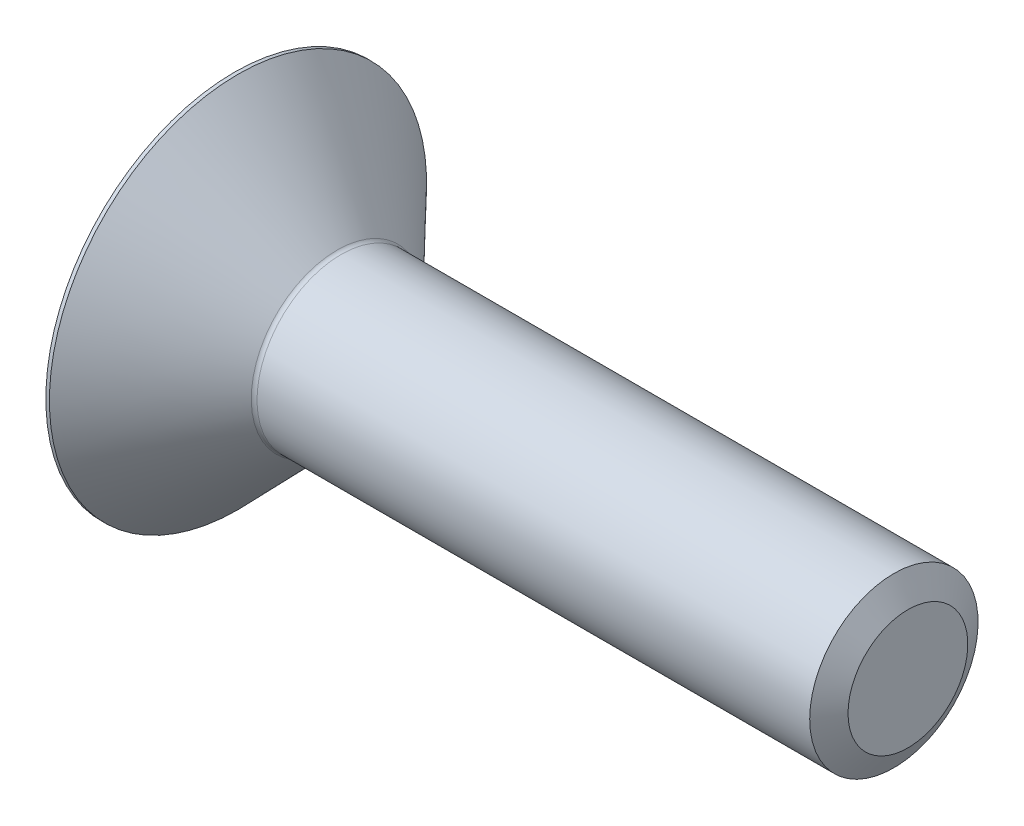
ISO-10303-21;
HEADER;
FILE_DESCRIPTION(('STEP AP214'),'2;1');
FILE_NAME('part.step','',(''),(''),'','','');
FILE_SCHEMA(('AUTOMOTIVE_DESIGN { 1 0 10303 214 1 1 1 1 }'));
ENDSEC;
DATA;
#1=APPLICATION_CONTEXT('core data for automotive mechanical design processes');
#2=APPLICATION_PROTOCOL_DEFINITION('international standard','automotive_design',2000,#1);
#3=PRODUCT_CONTEXT('',#1,'mechanical');
#4=PRODUCT('Part','Part','',(#3));
#5=PRODUCT_RELATED_PRODUCT_CATEGORY('part','',(#4));
#6=PRODUCT_DEFINITION_FORMATION('','',#4);
#7=PRODUCT_DEFINITION_CONTEXT('part definition',#1,'design');
#8=PRODUCT_DEFINITION('design','',#6,#7);
#9=PRODUCT_DEFINITION_SHAPE('','',#8);
#10=(LENGTH_UNIT() NAMED_UNIT(*) SI_UNIT(.MILLI.,.METRE.));
#11=(NAMED_UNIT(*) PLANE_ANGLE_UNIT() SI_UNIT($,.RADIAN.));
#12=(NAMED_UNIT(*) SI_UNIT($,.STERADIAN.) SOLID_ANGLE_UNIT());
#13=UNCERTAINTY_MEASURE_WITH_UNIT(LENGTH_MEASURE(1.E-05),#10,'distance_accuracy_value','');
#14=(GEOMETRIC_REPRESENTATION_CONTEXT(3) GLOBAL_UNCERTAINTY_ASSIGNED_CONTEXT((#13)) GLOBAL_UNIT_ASSIGNED_CONTEXT((#10,
#11,#12)) REPRESENTATION_CONTEXT('',''));
#15=CARTESIAN_POINT('',(0.,0.,0.));
#16=DIRECTION('',(0.,0.,1.));
#17=DIRECTION('',(1.,0.,0.));
#18=AXIS2_PLACEMENT_3D('',#15,#16,#17);
#19=CARTESIAN_POINT('',(0.,0.,0.));
#20=DIRECTION('',(1.,0.,0.));
#21=DIRECTION('',(0.,1.,0.));
#22=AXIS2_PLACEMENT_3D('',#19,#20,#21);
#23=CYLINDRICAL_SURFACE('',#22,1.5);
#24=CARTESIAN_POINT('',(-10.097552518379,0.,0.));
#25=DIRECTION('',(1.,0.,0.));
#26=DIRECTION('',(0.,1.,0.));
#27=AXIS2_PLACEMENT_3D('',#24,#25,#26);
#28=CIRCLE('',#27,1.5);
#29=CARTESIAN_POINT('',(-10.097552518379,1.5,0.));
#30=VERTEX_POINT('',#29);
#31=EDGE_CURVE('E123',#30,#30,#28,.T.);
#32=ORIENTED_EDGE('',*,*,#31,.T.);
#33=EDGE_LOOP('',(#32));
#34=FACE_BOUND('',#33,.T.);
#35=CARTESIAN_POINT('',(-0.25,0.,0.));
#36=DIRECTION('',(-1.,0.,0.));
#37=DIRECTION('',(0.,0.,1.));
#38=AXIS2_PLACEMENT_3D('',#35,#36,#37);
#39=CIRCLE('',#38,1.5);
#40=CARTESIAN_POINT('',(-0.25,0.,1.5));
#41=VERTEX_POINT('',#40);
#42=EDGE_CURVE('E114',#41,#41,#39,.T.);
#43=ORIENTED_EDGE('',*,*,#42,.T.);
#44=EDGE_LOOP('',(#43));
#45=FACE_BOUND('',#44,.T.);
#46=ADVANCED_FACE('F36',(#34,#45),#23,.T.);
#47=CARTESIAN_POINT('',(-12.,3.36,0.));
#48=DIRECTION('',(-1.,0.,0.));
#49=DIRECTION('',(0.,-1.,0.));
#50=AXIS2_PLACEMENT_3D('',#47,#48,#49);
#51=PLANE('',#50);
#52=CARTESIAN_POINT('',(-12.,0.,0.));
#53=DIRECTION('',(1.,0.,0.));
#54=DIRECTION('',(0.,1.,0.));
#55=AXIS2_PLACEMENT_3D('',#52,#53,#54);
#56=CIRCLE('',#55,3.36);
#57=CARTESIAN_POINT('',(-12.,3.36,0.));
#58=VERTEX_POINT('',#57);
#59=EDGE_CURVE('E206',#58,#58,#56,.T.);
#60=ORIENTED_EDGE('',*,*,#59,.F.);
#61=EDGE_LOOP('',(#60));
#62=FACE_BOUND('',#61,.T.);
#63=CARTESIAN_POINT('',(-12.,0.,0.));
#64=DIRECTION('',(-1.,0.,0.));
#65=DIRECTION('',(0.,-1.,0.));
#66=AXIS2_PLACEMENT_3D('',#63,#64,#65);
#67=CIRCLE('',#66,1.15470053837925);
#68=CARTESIAN_POINT('',(-12.,-0.577350269189631,0.999999999999995));
#69=VERTEX_POINT('',#68);
#70=CARTESIAN_POINT('',(-12.,-1.15470053837925,0.));
#71=VERTEX_POINT('',#70);
#72=EDGE_CURVE('E40',#69,#71,#67,.F.);
#73=ORIENTED_EDGE('',*,*,#72,.T.);
#74=CARTESIAN_POINT('',(-12.,-0.577350269189631,-0.999999999999996));
#75=VERTEX_POINT('',#74);
#76=EDGE_CURVE('E11',#71,#75,#67,.F.);
#77=ORIENTED_EDGE('',*,*,#76,.T.);
#78=CARTESIAN_POINT('',(-12.,0.577350269189625,-1.));
#79=VERTEX_POINT('',#78);
#80=EDGE_CURVE('E45',#75,#79,#67,.F.);
#81=ORIENTED_EDGE('',*,*,#80,.T.);
#82=CARTESIAN_POINT('',(-12.,1.15470053837925,0.));
#83=VERTEX_POINT('',#82);
#84=EDGE_CURVE('E110',#79,#83,#67,.F.);
#85=ORIENTED_EDGE('',*,*,#84,.T.);
#86=CARTESIAN_POINT('',(-12.,0.,0.));
#87=DIRECTION('',(-1.,0.,0.));
#88=DIRECTION('',(0.,0.,1.));
#89=AXIS2_PLACEMENT_3D('',#86,#87,#88);
#90=CIRCLE('',#89,1.15470053837925);
#91=CARTESIAN_POINT('',(-12.,0.577350269189628,0.999999999999997));
#92=VERTEX_POINT('',#91);
#93=EDGE_CURVE('E95',#92,#83,#90,.T.);
#94=ORIENTED_EDGE('',*,*,#93,.F.);
#95=EDGE_CURVE('E104',#92,#69,#67,.F.);
#96=ORIENTED_EDGE('',*,*,#95,.T.);
#97=EDGE_LOOP('',(#73,#77,#81,#85,#94,#96));
#98=FACE_BOUND('',#97,.T.);
#99=ADVANCED_FACE('F111',(#62,#98),#51,.T.);
#100=CARTESIAN_POINT('',(0.,0.,0.));
#101=DIRECTION('',(1.,0.,0.));
#102=DIRECTION('',(0.,1.,0.));
#103=AXIS2_PLACEMENT_3D('',#100,#101,#102);
#104=CYLINDRICAL_SURFACE('',#103,3.36);
#105=ORIENTED_EDGE('',*,*,#59,.T.);
#106=EDGE_LOOP('',(#105));
#107=FACE_BOUND('',#106,.T.);
#108=CARTESIAN_POINT('',(-11.9361811211411,0.,0.));
#109=DIRECTION('',(1.,0.,0.));
#110=DIRECTION('',(0.,1.,0.));
#111=AXIS2_PLACEMENT_3D('',#108,#109,#110);
#112=CIRCLE('',#111,3.36);
#113=CARTESIAN_POINT('',(-11.9361811211411,3.36,0.));
#114=VERTEX_POINT('',#113);
#115=EDGE_CURVE('E208',#114,#114,#112,.T.);
#116=ORIENTED_EDGE('',*,*,#115,.F.);
#117=EDGE_LOOP('',(#116));
#118=FACE_BOUND('',#117,.T.);
#119=ADVANCED_FACE('F196',(#107,#118),#104,.T.);
#120=CARTESIAN_POINT('',(-10.1694864984129,0.,0.));
#121=DIRECTION('',(-1.,0.,0.));
#122=DIRECTION('',(0.,-1.,0.));
#123=AXIS2_PLACEMENT_3D('',#120,#121,#122);
#124=CONICAL_SURFACE('',#123,1.5305341629541,0.802851455917394);
#125=ORIENTED_EDGE('',*,*,#115,.T.);
#126=EDGE_LOOP('',(#125));
#127=FACE_BOUND('',#126,.T.);
#128=CARTESIAN_POINT('',(-10.1694864984129,0.,0.));
#129=DIRECTION('',(1.,0.,0.));
#130=DIRECTION('',(0.,1.,0.));
#131=AXIS2_PLACEMENT_3D('',#128,#129,#130);
#132=CIRCLE('',#131,1.5305341629541);
#133=CARTESIAN_POINT('',(-10.1694864984129,1.5305341629541,0.));
#134=VERTEX_POINT('',#133);
#135=EDGE_CURVE('E212',#134,#134,#132,.T.);
#136=ORIENTED_EDGE('',*,*,#135,.F.);
#137=EDGE_LOOP('',(#136));
#138=FACE_BOUND('',#137,.T.);
#139=ADVANCED_FACE('F192',(#127,#138),#124,.T.);
#140=CARTESIAN_POINT('',(-10.097552518379,0.,0.));
#141=DIRECTION('',(1.,0.,0.));
#142=DIRECTION('',(0.,1.,0.));
#143=AXIS2_PLACEMENT_3D('',#140,#141,#142);
#144=TOROIDAL_SURFACE('',#143,1.6,0.1);
#145=ORIENTED_EDGE('',*,*,#135,.T.);
#146=EDGE_LOOP('',(#145));
#147=FACE_BOUND('',#146,.T.);
#148=ORIENTED_EDGE('',*,*,#31,.F.);
#149=EDGE_LOOP('',(#148));
#150=FACE_BOUND('',#149,.T.);
#151=ADVANCED_FACE('F188',(#147,#150),#144,.F.);
#152=CARTESIAN_POINT('',(-11.67,0.,0.));
#153=DIRECTION('',(-1.,0.,0.));
#154=DIRECTION('',(0.,0.,1.));
#155=AXIS2_PLACEMENT_3D('',#152,#153,#154);
#156=CONICAL_SURFACE('',#155,0.,1.2924281638629);
#157=CARTESIAN_POINT('',(-12.0000330049495,-0.577234799135789,1.0002));
#158=CARTESIAN_POINT('',(-11.9931767723132,-0.601209328784404,0.958674896561032));
#159=CARTESIAN_POINT('',(-11.986950249306,-0.625233209733957,0.917064314161421));
#160=CARTESIAN_POINT('',(-11.9760082019855,-0.673377505205148,0.83367594831071));
#161=CARTESIAN_POINT('',(-11.9712933817242,-0.697497959424799,0.791898096100636));
#162=CARTESIAN_POINT('',(-11.9636556441477,-0.745669161891496,0.70846312596663));
#163=CARTESIAN_POINT('',(-11.9607223745609,-0.769719488656234,0.66680673807147));
#164=CARTESIAN_POINT('',(-11.9567889588686,-0.817855017501818,0.58343355646172));
#165=CARTESIAN_POINT('',(-11.9557883832489,-0.841940210643129,0.54171677823086));
#166=CARTESIAN_POINT('',(-11.9557883832489,-0.890110596925751,0.458283221769139));
#167=CARTESIAN_POINT('',(-11.9567889588686,-0.914195790067062,0.416566443538279));
#168=CARTESIAN_POINT('',(-11.9607223745609,-0.962331318912647,0.333193261928529));
#169=CARTESIAN_POINT('',(-11.9636556441477,-0.986381645677385,0.29153687403337));
#170=CARTESIAN_POINT('',(-11.9712933817242,-1.03455284814408,0.208101903899363));
#171=CARTESIAN_POINT('',(-11.9760082019855,-1.05867330236373,0.166324051689289));
#172=CARTESIAN_POINT('',(-11.986950249306,-1.10681759783492,0.0829356858385784));
#173=CARTESIAN_POINT('',(-11.9931767723132,-1.13084147878448,0.0413251034389669));
#174=CARTESIAN_POINT('',(-12.0000330049495,-1.15481600843309,-0.000200000000000344));
#175=B_SPLINE_CURVE_WITH_KNOTS('',3,(#157,#158,#159,#160,#161,#162,#163,#164,#165,#166,#167,
#168,#169,#170,#171,#172,#173,#174),.UNSPECIFIED.,.F.,.F.,(4,2,2,2,2,2,2,2,4),(0.,
0.145319064827825,0.290705711767535,0.435239252261503,0.579740668498364,0.724242084735225,
0.868775625229193,1.0141622721689,1.15948133699673),.UNSPECIFIED.);
#176=EDGE_CURVE('E129',#69,#71,#175,.T.);
#177=ORIENTED_EDGE('',*,*,#176,.T.);
#178=ORIENTED_EDGE('',*,*,#72,.F.);
#179=EDGE_LOOP('',(#177,#178));
#180=FACE_BOUND('',#179,.T.);
#181=ADVANCED_FACE('F191',(#180),#156,.F.);
#182=CARTESIAN_POINT('',(-12.1864201247989,-1.50507658562174,1.));
#183=CARTESIAN_POINT('',(-12.1756805338984,-1.45995191683151,1.));
#184=CARTESIAN_POINT('',(-12.1650772555009,-1.41479478404147,1.));
#185=CARTESIAN_POINT('',(-12.1442124650908,-1.32439927872502,1.));
#186=CARTESIAN_POINT('',(-12.1339509706694,-1.27916090214299,1.));
#187=CARTESIAN_POINT('',(-12.1037611048582,-1.14320091952673,1.));
#188=CARTESIAN_POINT('',(-12.0844526928259,-1.0523395057026,1.));
#189=CARTESIAN_POINT('',(-12.0485427680109,-0.87102173365142,1.));
#190=CARTESIAN_POINT('',(-12.0319160072656,-0.780570478060275,1.));
#191=CARTESIAN_POINT('',(-12.0024593897724,-0.599053834032337,1.));
#192=CARTESIAN_POINT('',(-11.9896286440471,-0.507988594500086,1.));
#193=CARTESIAN_POINT('',(-11.9694337517461,-0.32401701013366,1.));
#194=CARTESIAN_POINT('',(-11.9621421851974,-0.231102062710143,1.));
#195=CARTESIAN_POINT('',(-11.9566778251239,-0.0915430747170628,1.));
#196=CARTESIAN_POINT('',(-11.9557682159605,-0.045000514493482,1.));
#197=CARTESIAN_POINT('',(-11.9558092297991,0.0480838901527617,1.));
#198=CARTESIAN_POINT('',(-11.9567598571057,0.0946257345735189,1.));
#199=CARTESIAN_POINT('',(-11.9623591123098,0.23457378392605,1.));
#200=CARTESIAN_POINT('',(-11.9697714997025,0.327875024932963,1.));
#201=CARTESIAN_POINT('',(-11.9903648179936,0.51386632785343,1.));
#202=CARTESIAN_POINT('',(-12.0035505473147,0.606555816131269,1.));
#203=CARTESIAN_POINT('',(-12.0343302733835,0.794559797027599,1.));
#204=CARTESIAN_POINT('',(-12.0520641733632,0.889850634542143,1.));
#205=CARTESIAN_POINT('',(-12.0901792888416,1.07990716554416,1.));
#206=CARTESIAN_POINT('',(-12.1105609899614,1.17467275936659,1.));
#207=CARTESIAN_POINT('',(-12.1530302070275,1.36384761434311,1.));
#208=CARTESIAN_POINT('',(-12.1751182493127,1.45825675605088,1.));
#209=CARTESIAN_POINT('',(-12.2204204884302,1.64680497415504,1.));
#210=CARTESIAN_POINT('',(-12.2436347126392,1.74094404392717,1.));
#211=CARTESIAN_POINT('',(-12.2904980732842,1.92768913293957,1.));
#212=CARTESIAN_POINT('',(-12.314136313184,2.02029789764918,1.));
#213=CARTESIAN_POINT('',(-12.3619465911489,2.20537976707471,1.));
#214=CARTESIAN_POINT('',(-12.3861186431025,2.2978528681941,1.));
#215=CARTESIAN_POINT('',(-12.4348136295748,2.48255351818147,1.));
#216=CARTESIAN_POINT('',(-12.4593359637595,2.57478122564271,1.));
#217=CARTESIAN_POINT('',(-12.5086763218414,2.75915354563859,1.));
#218=CARTESIAN_POINT('',(-12.5334943336762,2.8512981613992,1.));
#219=CARTESIAN_POINT('',(-12.5584153528749,2.94341459729474,1.));
#220=B_SPLINE_CURVE_WITH_KNOTS('',3,(#182,#183,#184,#185,#186,#187,#188,#189,#190,#191,#192,
#193,#194,#195,#196,#197,#198,#199,#200,#201,#202,#203,#204,#205,#206,#207,#208,#209,#210,#211,
#212,#213,#214,#215,#216,#217,#218,#219),.UNSPECIFIED.,.F.,.F.,(4,2,2,2,2,2,2,2,2,2,2,2,2,2,2,2,
2,2,4),(0.,0.139154753232828,0.278316657587893,0.556964604480121,0.83281288176632,
1.10859650773445,1.38793420964474,1.52755398880046,1.66717409104072,1.94769382621527,
2.22844715485888,2.519169414303,2.80994506926728,3.10081077796332,3.39168356097394,
3.67841536084619,3.96515462957441,4.25145053495921,4.53773480030589),.UNSPECIFIED.);
#221=EDGE_CURVE('E100',#92,#69,#220,.F.);
#222=ORIENTED_EDGE('',*,*,#221,.T.);
#223=ORIENTED_EDGE('',*,*,#95,.F.);
#224=EDGE_LOOP('',(#222,#223));
#225=FACE_BOUND('',#224,.T.);
#226=ADVANCED_FACE('F105',(#225),#156,.F.);
#227=CARTESIAN_POINT('',(-12.0000330049495,1.15481600843309,-0.000199999999999794));
#228=CARTESIAN_POINT('',(-11.9931767723132,1.13084147878447,0.0413251034389674));
#229=CARTESIAN_POINT('',(-11.986950249306,1.10681759783492,0.0829356858385789));
#230=CARTESIAN_POINT('',(-11.9760082019855,1.05867330236373,0.166324051689289));
#231=CARTESIAN_POINT('',(-11.9712933817242,1.03455284814408,0.208101903899364));
#232=CARTESIAN_POINT('',(-11.9636556441477,0.986381645677382,0.29153687403337));
#233=CARTESIAN_POINT('',(-11.9607223745609,0.962331318912644,0.33319326192853));
#234=CARTESIAN_POINT('',(-11.9567889588686,0.91419579006706,0.416566443538279));
#235=CARTESIAN_POINT('',(-11.9557883832489,0.890110596925749,0.458283221769139));
#236=CARTESIAN_POINT('',(-11.9557883832489,0.841940210643127,0.54171677823086));
#237=CARTESIAN_POINT('',(-11.9567889588686,0.817855017501815,0.58343355646172));
#238=CARTESIAN_POINT('',(-11.9607223745609,0.769719488656231,0.66680673807147));
#239=CARTESIAN_POINT('',(-11.9636556441477,0.745669161891493,0.70846312596663));
#240=CARTESIAN_POINT('',(-11.9712933817242,0.697497959424796,0.791898096100636));
#241=CARTESIAN_POINT('',(-11.9760082019855,0.673377505205145,0.83367594831071));
#242=CARTESIAN_POINT('',(-11.986950249306,0.625233209733955,0.917064314161421));
#243=CARTESIAN_POINT('',(-11.9931767723132,0.601209328784402,0.958674896561032));
#244=CARTESIAN_POINT('',(-12.0000330049495,0.577234799135787,1.0002));
#245=B_SPLINE_CURVE_WITH_KNOTS('',3,(#227,#228,#229,#230,#231,#232,#233,#234,#235,#236,#237,
#238,#239,#240,#241,#242,#243,#244),.UNSPECIFIED.,.F.,.F.,(4,2,2,2,2,2,2,2,4),(0.,
0.145319064827825,0.290705711767534,0.435239252261502,0.579740668498363,0.724242084735224,
0.868775625229192,1.0141622721689,1.15948133699673),.UNSPECIFIED.);
#246=EDGE_CURVE('E91',#83,#92,#245,.T.);
#247=ORIENTED_EDGE('',*,*,#246,.T.);
#248=ORIENTED_EDGE('',*,*,#93,.T.);
#249=EDGE_LOOP('',(#247,#248));
#250=FACE_BOUND('',#249,.T.);
#251=ADVANCED_FACE('F93',(#250),#156,.F.);
#252=CARTESIAN_POINT('',(-12.0000330049495,0.577234799135787,-1.0002));
#253=CARTESIAN_POINT('',(-11.9931767723132,0.601209328784402,-0.958674896561033));
#254=CARTESIAN_POINT('',(-11.986950249306,0.625233209733954,-0.917064314161421));
#255=CARTESIAN_POINT('',(-11.9760082019855,0.673377505205145,-0.833675948310711));
#256=CARTESIAN_POINT('',(-11.9712933817242,0.697497959424796,-0.791898096100636));
#257=CARTESIAN_POINT('',(-11.9636556441477,0.745669161891493,-0.70846312596663));
#258=CARTESIAN_POINT('',(-11.9607223745609,0.769719488656231,-0.66680673807147));
#259=CARTESIAN_POINT('',(-11.9567889588686,0.817855017501815,-0.583433556461721));
#260=CARTESIAN_POINT('',(-11.9557883832489,0.841940210643126,-0.54171677823086));
#261=CARTESIAN_POINT('',(-11.9557883832489,0.890110596925749,-0.45828322176914));
#262=CARTESIAN_POINT('',(-11.9567889588686,0.91419579006706,-0.416566443538279));
#263=CARTESIAN_POINT('',(-11.9607223745609,0.962331318912644,-0.33319326192853));
#264=CARTESIAN_POINT('',(-11.9636556441477,0.986381645677382,-0.29153687403337));
#265=CARTESIAN_POINT('',(-11.9712933817242,1.03455284814408,-0.208101903899364));
#266=CARTESIAN_POINT('',(-11.9760082019855,1.05867330236373,-0.166324051689289));
#267=CARTESIAN_POINT('',(-11.986950249306,1.10681759783492,-0.0829356858385788));
#268=CARTESIAN_POINT('',(-11.9931767723132,1.13084147878447,-0.0413251034389674));
#269=CARTESIAN_POINT('',(-12.0000330049495,1.15481600843309,0.000199999999999984));
#270=B_SPLINE_CURVE_WITH_KNOTS('',3,(#252,#253,#254,#255,#256,#257,#258,#259,#260,#261,#262,
#263,#264,#265,#266,#267,#268,#269),.UNSPECIFIED.,.F.,.F.,(4,2,2,2,2,2,2,2,4),(0.,
0.145319064827825,0.290705711767534,0.435239252261502,0.579740668498364,0.724242084735225,
0.868775625229193,1.0141622721689,1.15948133699673),.UNSPECIFIED.);
#271=EDGE_CURVE('E113',#79,#83,#270,.T.);
#272=ORIENTED_EDGE('',*,*,#271,.T.);
#273=ORIENTED_EDGE('',*,*,#84,.F.);
#274=EDGE_LOOP('',(#272,#273));
#275=FACE_BOUND('',#274,.T.);
#276=ADVANCED_FACE('F282',(#275),#156,.F.);
#277=CARTESIAN_POINT('',(-12.1864201247989,-1.50507658562174,-1.));
#278=CARTESIAN_POINT('',(-12.1756805338984,-1.45995191683151,-1.));
#279=CARTESIAN_POINT('',(-12.1650772555009,-1.41479478404147,-1.));
#280=CARTESIAN_POINT('',(-12.1442124650908,-1.32439927872502,-1.));
#281=CARTESIAN_POINT('',(-12.1339509706694,-1.27916090214299,-1.));
#282=CARTESIAN_POINT('',(-12.1037611048582,-1.14320091952673,-1.));
#283=CARTESIAN_POINT('',(-12.0844526928259,-1.0523395057026,-1.));
#284=CARTESIAN_POINT('',(-12.0485427680109,-0.87102173365142,-1.));
#285=CARTESIAN_POINT('',(-12.0319160072656,-0.780570478060275,-1.));
#286=CARTESIAN_POINT('',(-12.0024593897724,-0.599053834032337,-1.));
#287=CARTESIAN_POINT('',(-11.9896286440471,-0.507988594500086,-1.));
#288=CARTESIAN_POINT('',(-11.9694337517461,-0.32401701013366,-1.));
#289=CARTESIAN_POINT('',(-11.9621421851974,-0.231102062710143,-1.));
#290=CARTESIAN_POINT('',(-11.9566778251239,-0.0915430747170628,-1.));
#291=CARTESIAN_POINT('',(-11.9557682159605,-0.0450005144934818,-1.));
#292=CARTESIAN_POINT('',(-11.9558092297991,0.0480838901527619,-1.));
#293=CARTESIAN_POINT('',(-11.9567598571057,0.0946257345735192,-1.));
#294=CARTESIAN_POINT('',(-11.9623591123098,0.234573783926051,-1.));
#295=CARTESIAN_POINT('',(-11.9697714997025,0.327875024932963,-1.));
#296=CARTESIAN_POINT('',(-11.9903648179936,0.51386632785343,-1.));
#297=CARTESIAN_POINT('',(-12.0035505473147,0.606555816131269,-1.));
#298=CARTESIAN_POINT('',(-12.0343302733835,0.794559797027599,-1.));
#299=CARTESIAN_POINT('',(-12.0520641733632,0.889850634542143,-1.));
#300=CARTESIAN_POINT('',(-12.0901792888416,1.07990716554416,-1.));
#301=CARTESIAN_POINT('',(-12.1105609899614,1.17467275936659,-1.));
#302=CARTESIAN_POINT('',(-12.1530302070275,1.36384761434311,-1.));
#303=CARTESIAN_POINT('',(-12.1751182493127,1.45825675605088,-1.));
#304=CARTESIAN_POINT('',(-12.2204204884302,1.64680497415504,-1.));
#305=CARTESIAN_POINT('',(-12.2436347126392,1.74094404392717,-1.));
#306=CARTESIAN_POINT('',(-12.2904980732842,1.92768913293957,-1.));
#307=CARTESIAN_POINT('',(-12.314136313184,2.02029789764918,-1.));
#308=CARTESIAN_POINT('',(-12.3619465911489,2.20537976707471,-1.));
#309=CARTESIAN_POINT('',(-12.3861186431025,2.2978528681941,-1.));
#310=CARTESIAN_POINT('',(-12.4348136295748,2.48255351818147,-1.));
#311=CARTESIAN_POINT('',(-12.4593359637595,2.57478122564271,-1.));
#312=CARTESIAN_POINT('',(-12.5086763218414,2.75915354563859,-1.));
#313=CARTESIAN_POINT('',(-12.5334943336762,2.8512981613992,-1.));
#314=CARTESIAN_POINT('',(-12.5584153528749,2.94341459729474,-1.));
#315=B_SPLINE_CURVE_WITH_KNOTS('',3,(#277,#278,#279,#280,#281,#282,#283,#284,#285,#286,#287,
#288,#289,#290,#291,#292,#293,#294,#295,#296,#297,#298,#299,#300,#301,#302,#303,#304,#305,#306,
#307,#308,#309,#310,#311,#312,#313,#314),.UNSPECIFIED.,.F.,.F.,(4,2,2,2,2,2,2,2,2,2,2,2,2,2,2,2,
2,2,4),(0.,0.139154753232827,0.278316657587892,0.556964604480121,0.83281288176632,
1.10859650773445,1.38793420964474,1.52755398880046,1.66717409104072,1.94769382621527,
2.22844715485888,2.519169414303,2.80994506926728,3.10081077796332,3.39168356097394,
3.67841536084619,3.96515462957441,4.25145053495921,4.53773480030589),.UNSPECIFIED.);
#316=EDGE_CURVE('E241',#75,#79,#315,.T.);
#317=ORIENTED_EDGE('',*,*,#316,.T.);
#318=ORIENTED_EDGE('',*,*,#80,.F.);
#319=EDGE_LOOP('',(#317,#318));
#320=FACE_BOUND('',#319,.T.);
#321=ADVANCED_FACE('F269',(#320),#156,.F.);
#322=CARTESIAN_POINT('',(-12.0000330049495,-1.15481600843309,0.000199999999999856));
#323=CARTESIAN_POINT('',(-11.9931767723132,-1.13084147878448,-0.0413251034389675));
#324=CARTESIAN_POINT('',(-11.986950249306,-1.10681759783492,-0.082935685838579));
#325=CARTESIAN_POINT('',(-11.9760082019855,-1.05867330236373,-0.16632405168929));
#326=CARTESIAN_POINT('',(-11.9712933817242,-1.03455284814408,-0.208101903899364));
#327=CARTESIAN_POINT('',(-11.9636556441477,-0.986381645677385,-0.29153687403337));
#328=CARTESIAN_POINT('',(-11.9607223745609,-0.962331318912647,-0.33319326192853));
#329=CARTESIAN_POINT('',(-11.9567889588686,-0.914195790067062,-0.416566443538279));
#330=CARTESIAN_POINT('',(-11.9557883832489,-0.890110596925751,-0.45828322176914));
#331=CARTESIAN_POINT('',(-11.9557883832489,-0.841940210643129,-0.54171677823086));
#332=CARTESIAN_POINT('',(-11.9567889588686,-0.817855017501818,-0.583433556461721));
#333=CARTESIAN_POINT('',(-11.9607223745609,-0.769719488656234,-0.66680673807147));
#334=CARTESIAN_POINT('',(-11.9636556441477,-0.745669161891496,-0.70846312596663));
#335=CARTESIAN_POINT('',(-11.9712933817242,-0.697497959424799,-0.791898096100636));
#336=CARTESIAN_POINT('',(-11.9760082019855,-0.673377505205148,-0.83367594831071));
#337=CARTESIAN_POINT('',(-11.986950249306,-0.625233209733957,-0.917064314161421));
#338=CARTESIAN_POINT('',(-11.9931767723132,-0.601209328784404,-0.958674896561032));
#339=CARTESIAN_POINT('',(-12.0000330049495,-0.577234799135789,-1.0002));
#340=B_SPLINE_CURVE_WITH_KNOTS('',3,(#322,#323,#324,#325,#326,#327,#328,#329,#330,#331,#332,
#333,#334,#335,#336,#337,#338,#339),.UNSPECIFIED.,.F.,.F.,(4,2,2,2,2,2,2,2,4),(0.,
0.145319064827825,0.290705711767534,0.435239252261502,0.579740668498364,0.724242084735225,
0.868775625229193,1.0141622721689,1.15948133699673),.UNSPECIFIED.);
#341=EDGE_CURVE('E131',#71,#75,#340,.T.);
#342=ORIENTED_EDGE('',*,*,#341,.T.);
#343=ORIENTED_EDGE('',*,*,#76,.F.);
#344=EDGE_LOOP('',(#342,#343));
#345=FACE_BOUND('',#344,.T.);
#346=ADVANCED_FACE('F272',(#345),#156,.F.);
#347=CARTESIAN_POINT('',(-10.9,0.,0.));
#348=DIRECTION('',(-1.,0.,0.));
#349=DIRECTION('',(0.,0.,1.));
#350=AXIS2_PLACEMENT_3D('',#347,#348,#349);
#351=CONICAL_SURFACE('',#350,1.15470053837925,1.0471975511966);
#352=CARTESIAN_POINT('',(-10.2333333333333,0.,0.));
#353=VERTEX_POINT('',#352);
#354=VERTEX_LOOP('',#353);
#355=FACE_BOUND('',#354,.T.);
#356=CARTESIAN_POINT('',(-11.2718352887395,-1.49514512143374,1.));
#357=CARTESIAN_POINT('',(-11.2511150207934,-1.4519612611533,1.));
#358=CARTESIAN_POINT('',(-11.2306136723495,-1.40867282404236,1.));
#359=CARTESIAN_POINT('',(-11.1901634335246,-1.32182947914248,1.));
#360=CARTESIAN_POINT('',(-11.1702146425673,-1.27827452509756,1.));
#361=CARTESIAN_POINT('',(-11.1111451548365,-1.14662339890625,1.));
#362=CARTESIAN_POINT('',(-11.073052526533,-1.05805724149108,1.));
#363=CARTESIAN_POINT('',(-11.0002458207006,-0.876833003172497,1.));
#364=CARTESIAN_POINT('',(-10.9656458404539,-0.784128452056496,1.));
#365=CARTESIAN_POINT('',(-10.9040734738185,-0.596331746532131,1.));
#366=CARTESIAN_POINT('',(-10.8770812848479,-0.501246505541256,1.));
#367=CARTESIAN_POINT('',(-10.845775770035,-0.356699986452703,1.));
#368=CARTESIAN_POINT('',(-10.836875098547,-0.308244163171709,1.));
#369=CARTESIAN_POINT('',(-10.8227424317569,-0.210788870695443,1.));
#370=CARTESIAN_POINT('',(-10.8175101885352,-0.161789438465742,1.));
#371=CARTESIAN_POINT('',(-10.8111989809818,-0.0641060489970663,1.));
#372=CARTESIAN_POINT('',(-10.8100710050111,-0.0154253461269772,1.));
#373=CARTESIAN_POINT('',(-10.8119329783051,0.0818553564032754,1.));
#374=CARTESIAN_POINT('',(-10.8149231825536,0.130455350879702,1.));
#375=CARTESIAN_POINT('',(-10.8271183217293,0.250369589613778,1.));
#376=CARTESIAN_POINT('',(-10.8386085609849,0.321451919115027,1.));
#377=CARTESIAN_POINT('',(-10.8682403173976,0.462229038490168,1.));
#378=CARTESIAN_POINT('',(-10.8863898509449,0.531922048861733,1.));
#379=CARTESIAN_POINT('',(-10.9278697226866,0.671415729806806,1.));
#380=CARTESIAN_POINT('',(-10.9513071683069,0.741183729418071,1.));
#381=CARTESIAN_POINT('',(-11.0015644882464,0.879438319396289,1.));
#382=CARTESIAN_POINT('',(-11.0283831752305,0.94792534993256,1.));
#383=CARTESIAN_POINT('',(-11.1000539154734,1.12214515906645,1.));
#384=CARTESIAN_POINT('',(-11.146572305199,1.22718574040678,1.));
#385=CARTESIAN_POINT('',(-11.242876922248,1.43575968104558,1.));
#386=CARTESIAN_POINT('',(-11.2926639878222,1.53929264533348,1.));
#387=CARTESIAN_POINT('',(-11.3943364445346,1.74546702338822,1.));
#388=CARTESIAN_POINT('',(-11.446224181867,1.84810727553999,1.));
#389=CARTESIAN_POINT('',(-11.5513383688352,2.05270058021726,1.));
#390=CARTESIAN_POINT('',(-11.6045648626723,2.15465360991172,1.));
#391=CARTESIAN_POINT('',(-11.7068669169112,2.34846553091283,1.));
#392=CARTESIAN_POINT('',(-11.755859658964,2.44036823161571,1.));
#393=CARTESIAN_POINT('',(-11.8544031328282,2.623877990053,1.));
#394=CARTESIAN_POINT('',(-11.9039538852895,2.71548503668387,1.));
#395=CARTESIAN_POINT('',(-12.0033471076798,2.89823865557593,1.));
#396=CARTESIAN_POINT('',(-12.053188515041,2.98938580641155,1.));
#397=CARTESIAN_POINT('',(-12.1531957233761,3.17149583112622,1.));
#398=CARTESIAN_POINT('',(-12.2033615072371,3.26245871439935,1.));
#399=CARTESIAN_POINT('',(-12.253646212205,3.35335539208175,1.));
#400=B_SPLINE_CURVE_WITH_KNOTS('',3,(#356,#357,#358,#359,#360,#361,#362,#363,#364,#365,#366,
#367,#368,#369,#370,#371,#372,#373,#374,#375,#376,#377,#378,#379,#380,#381,#382,#383,#384,#385,
#386,#387,#388,#389,#390,#391,#392,#393,#394,#395,#396,#397,#398,#399),.UNSPECIFIED.,.F.,.F.,(4,
2,2,2,2,2,2,2,2,2,2,2,2,2,2,2,2,2,2,2,2,4),(0.,0.143690341820649,0.287406372566272,
0.57656033287749,0.873259488934029,1.16917907000006,1.31686338831957,1.46453772487642,
1.61044269221658,1.75635669390451,1.97192533331897,2.18775432802313,2.40842600301165,
2.62902040304935,2.97355048126458,3.31816926186283,3.66318417395131,4.00821049225242,
4.32064609598596,4.63309330006988,4.94474578248761,5.2563819552864),.UNSPECIFIED.);
#401=CARTESIAN_POINT('',(-10.9,-0.577350269189627,1.));
#402=VERTEX_POINT('',#401);
#403=CARTESIAN_POINT('',(-10.9,0.577350269189625,1.));
#404=VERTEX_POINT('',#403);
#405=EDGE_CURVE('E160',#402,#404,#400,.T.);
#406=ORIENTED_EDGE('',*,*,#405,.T.);
#407=CARTESIAN_POINT('',(-10.9000666766657,0.577234799135787,1.0002));
#408=CARTESIAN_POINT('',(-10.8854089736491,0.602607795820546,0.95625268060172));
#409=CARTESIAN_POINT('',(-10.8720777236209,0.628199807531656,0.91192601605018));
#410=CARTESIAN_POINT('',(-10.8488065076235,0.67982709833083,0.822504925328878));
#411=CARTESIAN_POINT('',(-10.8388747765498,0.705863295614157,0.777408908798269));
#412=CARTESIAN_POINT('',(-10.8234126948821,0.757612978088366,0.687775829477381));
#413=CARTESIAN_POINT('',(-10.817779468099,0.783318495222182,0.643252567766781));
#414=CARTESIAN_POINT('',(-10.8110512886403,0.83485064837367,0.553996260284983));
#415=CARTESIAN_POINT('',(-10.8099507679217,0.86067709674978,0.509263539518505));
#416=CARTESIAN_POINT('',(-10.8122250522981,0.908946264126689,0.425658889182653));
#417=CARTESIAN_POINT('',(-10.8150414388634,0.931396163287556,0.386774523211234));
#418=CARTESIAN_POINT('',(-10.8239724502174,0.976149681982092,0.309259155014814));
#419=CARTESIAN_POINT('',(-10.8300901337543,0.998453146411449,0.270628421438361));
#420=CARTESIAN_POINT('',(-10.8453857257258,1.04329913914046,0.192952883515855));
#421=CARTESIAN_POINT('',(-10.854628552169,1.0658359836813,0.153917923728833));
#422=CARTESIAN_POINT('',(-10.8756068457555,1.11057330008463,0.0764306187239882));
#423=CARTESIAN_POINT('',(-10.8873373751337,1.13277434629517,0.0379772787061411));
#424=CARTESIAN_POINT('',(-10.9000666766657,1.15481600843309,-0.000199999999999575));
#425=B_SPLINE_CURVE_WITH_KNOTS('',3,(#407,#408,#409,#410,#411,#412,#413,#414,#415,#416,#417,
#418,#419,#420,#421,#422,#423,#424),.UNSPECIFIED.,.F.,.F.,(4,2,2,2,2,2,2,2,4),(0.,
0.158523820030115,0.317428970089342,0.472400167924633,0.627180939971648,0.762016584872711,
0.896977373984232,1.03493410168667,1.17261952416172),.UNSPECIFIED.);
#426=CARTESIAN_POINT('',(-10.9,1.15470053837925,0.));
#427=VERTEX_POINT('',#426);
#428=EDGE_CURVE('E120',#404,#427,#425,.T.);
#429=ORIENTED_EDGE('',*,*,#428,.T.);
#430=CARTESIAN_POINT('',(-10.9000666766657,1.15481600843309,0.000200000000000205));
#431=CARTESIAN_POINT('',(-10.8854089736491,1.12944301174833,-0.0437473193982795));
#432=CARTESIAN_POINT('',(-10.8720777236209,1.10385100003722,-0.0880739839498197));
#433=CARTESIAN_POINT('',(-10.8488065076235,1.05222370923805,-0.177495074671121));
#434=CARTESIAN_POINT('',(-10.8388747765498,1.02618751195472,-0.222591091201731));
#435=CARTESIAN_POINT('',(-10.8234126948821,0.974437829480509,-0.312224170522618));
#436=CARTESIAN_POINT('',(-10.817779468099,0.948732312346694,-0.356747432233219));
#437=CARTESIAN_POINT('',(-10.8110512886403,0.897200159195206,-0.446003739715017));
#438=CARTESIAN_POINT('',(-10.8099507679217,0.871373710819096,-0.490736460481494));
#439=CARTESIAN_POINT('',(-10.8122250522981,0.823104543442187,-0.574341110817346));
#440=CARTESIAN_POINT('',(-10.8150414388634,0.80065464428132,-0.613225476788766));
#441=CARTESIAN_POINT('',(-10.8239724502174,0.755901125586784,-0.690740844985186));
#442=CARTESIAN_POINT('',(-10.8300901337543,0.733597661157426,-0.729371578561639));
#443=CARTESIAN_POINT('',(-10.8453857257258,0.688751668428418,-0.807047116484145));
#444=CARTESIAN_POINT('',(-10.854628552169,0.666214823887574,-0.846082076271168));
#445=CARTESIAN_POINT('',(-10.8756068457555,0.621477507484249,-0.923569381276012));
#446=CARTESIAN_POINT('',(-10.8873373751337,0.599276461273704,-0.96202272129386));
#447=CARTESIAN_POINT('',(-10.9000666766657,0.577234799135787,-1.0002));
#448=B_SPLINE_CURVE_WITH_KNOTS('',3,(#430,#431,#432,#433,#434,#435,#436,#437,#438,#439,#440,
#441,#442,#443,#444,#445,#446,#447),.UNSPECIFIED.,.F.,.F.,(4,2,2,2,2,2,2,2,4),(0.,
0.158523820030115,0.317428970089342,0.472400167924633,0.627180939971647,0.76201658487271,
0.896977373984232,1.03493410168667,1.17261952416172),.UNSPECIFIED.);
#449=CARTESIAN_POINT('',(-10.9,0.577350269189626,-0.999999999999999));
#450=VERTEX_POINT('',#449);
#451=EDGE_CURVE('E207',#427,#450,#448,.T.);
#452=ORIENTED_EDGE('',*,*,#451,.T.);
#453=CARTESIAN_POINT('',(-11.2718352887395,-1.49514512143374,-1.));
#454=CARTESIAN_POINT('',(-11.2511150207934,-1.4519612611533,-1.));
#455=CARTESIAN_POINT('',(-11.2306136723495,-1.40867282404236,-1.));
#456=CARTESIAN_POINT('',(-11.1901634335246,-1.32182947914248,-1.));
#457=CARTESIAN_POINT('',(-11.1702146425673,-1.27827452509756,-1.));
#458=CARTESIAN_POINT('',(-11.1111451548365,-1.14662339890625,-1.));
#459=CARTESIAN_POINT('',(-11.073052526533,-1.05805724149108,-1.));
#460=CARTESIAN_POINT('',(-11.0002458207006,-0.876833003172497,-1.));
#461=CARTESIAN_POINT('',(-10.9656458404539,-0.784128452056495,-1.));
#462=CARTESIAN_POINT('',(-10.9040734738185,-0.59633174653213,-1.));
#463=CARTESIAN_POINT('',(-10.8770812848479,-0.501246505541256,-1.));
#464=CARTESIAN_POINT('',(-10.845775770035,-0.356699986452703,-1.));
#465=CARTESIAN_POINT('',(-10.836875098547,-0.308244163171709,-1.));
#466=CARTESIAN_POINT('',(-10.8227424317569,-0.210788870695443,-1.));
#467=CARTESIAN_POINT('',(-10.8175101885352,-0.161789438465742,-1.));
#468=CARTESIAN_POINT('',(-10.8111989809818,-0.0641060489970657,-1.));
#469=CARTESIAN_POINT('',(-10.8100710050111,-0.0154253461269766,-1.));
#470=CARTESIAN_POINT('',(-10.8119329783051,0.0818553564032758,-1.));
#471=CARTESIAN_POINT('',(-10.8149231825536,0.130455350879703,-1.));
#472=CARTESIAN_POINT('',(-10.8271183217293,0.250369589613779,-1.));
#473=CARTESIAN_POINT('',(-10.8386085609849,0.321451919115028,-1.));
#474=CARTESIAN_POINT('',(-10.8682403173976,0.462229038490168,-1.));
#475=CARTESIAN_POINT('',(-10.8863898509449,0.531922048861733,-1.));
#476=CARTESIAN_POINT('',(-10.9278697226866,0.671415729806806,-1.));
#477=CARTESIAN_POINT('',(-10.9513071683069,0.741183729418071,-1.));
#478=CARTESIAN_POINT('',(-11.0015644882464,0.879438319396289,-1.));
#479=CARTESIAN_POINT('',(-11.0283831752305,0.947925349932561,-1.));
#480=CARTESIAN_POINT('',(-11.1000539154734,1.12214515906645,-1.));
#481=CARTESIAN_POINT('',(-11.146572305199,1.22718574040678,-1.));
#482=CARTESIAN_POINT('',(-11.242876922248,1.43575968104558,-1.));
#483=CARTESIAN_POINT('',(-11.2926639878222,1.53929264533347,-1.));
#484=CARTESIAN_POINT('',(-11.3943364445346,1.74546702338821,-1.));
#485=CARTESIAN_POINT('',(-11.446224181867,1.84810727553999,-1.));
#486=CARTESIAN_POINT('',(-11.5513383688352,2.05270058021726,-1.));
#487=CARTESIAN_POINT('',(-11.6045648626723,2.15465360991172,-1.));
#488=CARTESIAN_POINT('',(-11.7068669169112,2.34846553091283,-1.));
#489=CARTESIAN_POINT('',(-11.755859658964,2.44036823161571,-1.));
#490=CARTESIAN_POINT('',(-11.8544031328282,2.623877990053,-1.));
#491=CARTESIAN_POINT('',(-11.9039538852895,2.71548503668387,-1.));
#492=CARTESIAN_POINT('',(-12.0033471076798,2.89823865557593,-1.));
#493=CARTESIAN_POINT('',(-12.053188515041,2.98938580641155,-1.));
#494=CARTESIAN_POINT('',(-12.1531957233761,3.17149583112622,-1.));
#495=CARTESIAN_POINT('',(-12.2033615072371,3.26245871439935,-1.));
#496=CARTESIAN_POINT('',(-12.253646212205,3.35335539208175,-1.));
#497=B_SPLINE_CURVE_WITH_KNOTS('',3,(#453,#454,#455,#456,#457,#458,#459,#460,#461,#462,#463,
#464,#465,#466,#467,#468,#469,#470,#471,#472,#473,#474,#475,#476,#477,#478,#479,#480,#481,#482,
#483,#484,#485,#486,#487,#488,#489,#490,#491,#492,#493,#494,#495,#496),.UNSPECIFIED.,.F.,.F.,(4,
2,2,2,2,2,2,2,2,2,2,2,2,2,2,2,2,2,2,2,2,4),(0.,0.143690341820649,0.287406372566272,
0.57656033287749,0.873259488934029,1.16917907000006,1.31686338831957,1.46453772487642,
1.61044269221658,1.75635669390451,1.97192533331897,2.18775432802313,2.40842600301165,
2.62902040304935,2.97355048126458,3.31816926186283,3.6631841739513,4.00821049225242,
4.32064609598596,4.63309330006987,4.9447457824876,5.2563819552864),.UNSPECIFIED.);
#498=CARTESIAN_POINT('',(-10.9,-0.577350269189627,-1.));
#499=VERTEX_POINT('',#498);
#500=EDGE_CURVE('E99',#450,#499,#497,.F.);
#501=ORIENTED_EDGE('',*,*,#500,.T.);
#502=CARTESIAN_POINT('',(-10.9000666766657,-0.577234799135789,-1.0002));
#503=CARTESIAN_POINT('',(-10.8854089736491,-0.602607795820548,-0.95625268060172));
#504=CARTESIAN_POINT('',(-10.8720777236209,-0.628199807531658,-0.91192601605018));
#505=CARTESIAN_POINT('',(-10.8488065076235,-0.679827098330832,-0.822504925328878));
#506=CARTESIAN_POINT('',(-10.8388747765498,-0.705863295614159,-0.777408908798268));
#507=CARTESIAN_POINT('',(-10.8234126948821,-0.757612978088369,-0.687775829477381));
#508=CARTESIAN_POINT('',(-10.817779468099,-0.783318495222184,-0.64325256776678));
#509=CARTESIAN_POINT('',(-10.8110512886403,-0.834850648373673,-0.553996260284982));
#510=CARTESIAN_POINT('',(-10.8099507679217,-0.860677096749782,-0.509263539518505));
#511=CARTESIAN_POINT('',(-10.8122250522981,-0.908946264126691,-0.425658889182653));
#512=CARTESIAN_POINT('',(-10.8150414388634,-0.931396163287558,-0.386774523211233));
#513=CARTESIAN_POINT('',(-10.8239724502174,-0.976149681982094,-0.309259155014813));
#514=CARTESIAN_POINT('',(-10.8300901337543,-0.998453146411452,-0.27062842143836));
#515=CARTESIAN_POINT('',(-10.8453857257258,-1.04329913914046,-0.192952883515855));
#516=CARTESIAN_POINT('',(-10.854628552169,-1.0658359836813,-0.153917923728832));
#517=CARTESIAN_POINT('',(-10.8756068457555,-1.11057330008463,-0.0764306187239879));
#518=CARTESIAN_POINT('',(-10.8873373751337,-1.13277434629517,-0.0379772787061408));
#519=CARTESIAN_POINT('',(-10.9000666766657,-1.15481600843309,0.000199999999999746));
#520=B_SPLINE_CURVE_WITH_KNOTS('',3,(#502,#503,#504,#505,#506,#507,#508,#509,#510,#511,#512,
#513,#514,#515,#516,#517,#518,#519),.UNSPECIFIED.,.F.,.F.,(4,2,2,2,2,2,2,2,4),(0.,
0.158523820030115,0.317428970089343,0.472400167924634,0.627180939971649,0.762016584872711,
0.896977373984233,1.03493410168667,1.17261952416172),.UNSPECIFIED.);
#521=CARTESIAN_POINT('',(-10.9,-1.15470053837925,0.));
#522=VERTEX_POINT('',#521);
#523=EDGE_CURVE('E256',#499,#522,#520,.T.);
#524=ORIENTED_EDGE('',*,*,#523,.T.);
#525=CARTESIAN_POINT('',(-10.9000666766657,-1.15481600843309,-0.000200000000000144));
#526=CARTESIAN_POINT('',(-10.8854089736491,-1.12944301174833,0.0437473193982799));
#527=CARTESIAN_POINT('',(-10.8720777236209,-1.10385100003722,0.0880739839498203));
#528=CARTESIAN_POINT('',(-10.8488065076235,-1.05222370923805,0.177495074671122));
#529=CARTESIAN_POINT('',(-10.8388747765498,-1.02618751195472,0.222591091201731));
#530=CARTESIAN_POINT('',(-10.8234126948821,-0.974437829480511,0.312224170522619));
#531=CARTESIAN_POINT('',(-10.817779468099,-0.948732312346696,0.35674743223322));
#532=CARTESIAN_POINT('',(-10.8110512886403,-0.897200159195207,0.446003739715018));
#533=CARTESIAN_POINT('',(-10.8099507679217,-0.871373710819098,0.490736460481495));
#534=CARTESIAN_POINT('',(-10.8122250522981,-0.823104543442189,0.574341110817347));
#535=CARTESIAN_POINT('',(-10.8150414388634,-0.800654644281322,0.613225476788767));
#536=CARTESIAN_POINT('',(-10.8239724502174,-0.755901125586786,0.690740844985187));
#537=CARTESIAN_POINT('',(-10.8300901337543,-0.733597661157428,0.72937157856164));
#538=CARTESIAN_POINT('',(-10.8453857257258,-0.68875166842842,0.807047116484145));
#539=CARTESIAN_POINT('',(-10.854628552169,-0.666214823887577,0.846082076271168));
#540=CARTESIAN_POINT('',(-10.8756068457555,-0.621477507484251,0.923569381276012));
#541=CARTESIAN_POINT('',(-10.8873373751337,-0.599276461273707,0.962022721293859));
#542=CARTESIAN_POINT('',(-10.9000666766657,-0.577234799135789,1.0002));
#543=B_SPLINE_CURVE_WITH_KNOTS('',3,(#525,#526,#527,#528,#529,#530,#531,#532,#533,#534,#535,
#536,#537,#538,#539,#540,#541,#542),.UNSPECIFIED.,.F.,.F.,(4,2,2,2,2,2,2,2,4),(0.,
0.158523820030116,0.317428970089343,0.472400167924634,0.627180939971649,0.762016584872711,
0.896977373984233,1.03493410168667,1.17261952416172),.UNSPECIFIED.);
#544=EDGE_CURVE('E166',#522,#402,#543,.T.);
#545=ORIENTED_EDGE('',*,*,#544,.T.);
#546=EDGE_LOOP('',(#406,#429,#452,#501,#524,#545));
#547=FACE_BOUND('',#546,.T.);
#548=ADVANCED_FACE('F154',(#355,#547),#351,.F.);
#549=CARTESIAN_POINT('',(-10.04,1.15470053837925,0.));
#550=DIRECTION('',(0.,0.866025403784439,-0.5));
#551=DIRECTION('',(0.,0.5,0.866025403784439));
#552=AXIS2_PLACEMENT_3D('',#549,#550,#551);
#553=PLANE('',#552);
#554=ORIENTED_EDGE('',*,*,#271,.F.);
#555=DIRECTION('',(-1.,0.,0.));
#556=VECTOR('',#555,1.);
#557=CARTESIAN_POINT('',(-10.04,0.577350269189625,-1.));
#558=LINE('',#557,#556);
#559=EDGE_CURVE('E224',#450,#79,#558,.T.);
#560=ORIENTED_EDGE('',*,*,#559,.F.);
#561=ORIENTED_EDGE('',*,*,#451,.F.);
#562=DIRECTION('',(-1.,0.,0.));
#563=VECTOR('',#562,1.);
#564=CARTESIAN_POINT('',(-10.04,1.15470053837925,0.));
#565=LINE('',#564,#563);
#566=EDGE_CURVE('E174',#427,#83,#565,.T.);
#567=ORIENTED_EDGE('',*,*,#566,.T.);
#568=EDGE_LOOP('',(#554,#560,#561,#567));
#569=FACE_BOUND('',#568,.T.);
#570=ADVANCED_FACE('F181',(#569),#553,.F.);
#571=CARTESIAN_POINT('',(-10.04,0.577350269189625,-1.));
#572=DIRECTION('',(0.,0.,-1.));
#573=DIRECTION('',(-1.,0.,0.));
#574=AXIS2_PLACEMENT_3D('',#571,#572,#573);
#575=PLANE('',#574);
#576=ORIENTED_EDGE('',*,*,#316,.F.);
#577=DIRECTION('',(-1.,0.,0.));
#578=VECTOR('',#577,1.);
#579=CARTESIAN_POINT('',(-10.04,-0.577350269189627,-1.));
#580=LINE('',#579,#578);
#581=EDGE_CURVE('E227',#499,#75,#580,.T.);
#582=ORIENTED_EDGE('',*,*,#581,.F.);
#583=ORIENTED_EDGE('',*,*,#500,.F.);
#584=ORIENTED_EDGE('',*,*,#559,.T.);
#585=EDGE_LOOP('',(#576,#582,#583,#584));
#586=FACE_BOUND('',#585,.T.);
#587=ADVANCED_FACE('F253',(#586),#575,.F.);
#588=CARTESIAN_POINT('',(-10.04,-0.577350269189627,-1.));
#589=DIRECTION('',(0.,-0.866025403784438,-0.5));
#590=DIRECTION('',(0.,0.5,-0.866025403784439));
#591=AXIS2_PLACEMENT_3D('',#588,#589,#590);
#592=PLANE('',#591);
#593=ORIENTED_EDGE('',*,*,#341,.F.);
#594=DIRECTION('',(-1.,0.,0.));
#595=VECTOR('',#594,1.);
#596=CARTESIAN_POINT('',(-10.04,-1.15470053837925,0.));
#597=LINE('',#596,#595);
#598=EDGE_CURVE('E230',#522,#71,#597,.T.);
#599=ORIENTED_EDGE('',*,*,#598,.F.);
#600=ORIENTED_EDGE('',*,*,#523,.F.);
#601=ORIENTED_EDGE('',*,*,#581,.T.);
#602=EDGE_LOOP('',(#593,#599,#600,#601));
#603=FACE_BOUND('',#602,.T.);
#604=ADVANCED_FACE('F238',(#603),#592,.F.);
#605=CARTESIAN_POINT('',(-10.04,-1.15470053837925,0.));
#606=DIRECTION('',(0.,-0.866025403784439,0.5));
#607=DIRECTION('',(0.,-0.5,-0.866025403784439));
#608=AXIS2_PLACEMENT_3D('',#605,#606,#607);
#609=PLANE('',#608);
#610=ORIENTED_EDGE('',*,*,#176,.F.);
#611=DIRECTION('',(-1.,0.,0.));
#612=VECTOR('',#611,1.);
#613=CARTESIAN_POINT('',(-10.04,-0.577350269189627,1.));
#614=LINE('',#613,#612);
#615=EDGE_CURVE('E124',#402,#69,#614,.T.);
#616=ORIENTED_EDGE('',*,*,#615,.F.);
#617=ORIENTED_EDGE('',*,*,#544,.F.);
#618=ORIENTED_EDGE('',*,*,#598,.T.);
#619=EDGE_LOOP('',(#610,#616,#617,#618));
#620=FACE_BOUND('',#619,.T.);
#621=ADVANCED_FACE('F153',(#620),#609,.F.);
#622=CARTESIAN_POINT('',(-10.04,-0.577350269189627,1.));
#623=DIRECTION('',(0.,0.,1.));
#624=DIRECTION('',(1.,0.,0.));
#625=AXIS2_PLACEMENT_3D('',#622,#623,#624);
#626=PLANE('',#625);
#627=ORIENTED_EDGE('',*,*,#221,.F.);
#628=DIRECTION('',(-1.,0.,0.));
#629=VECTOR('',#628,1.);
#630=CARTESIAN_POINT('',(-10.04,0.577350269189625,1.));
#631=LINE('',#630,#629);
#632=EDGE_CURVE('E117',#404,#92,#631,.T.);
#633=ORIENTED_EDGE('',*,*,#632,.F.);
#634=ORIENTED_EDGE('',*,*,#405,.F.);
#635=ORIENTED_EDGE('',*,*,#615,.T.);
#636=EDGE_LOOP('',(#627,#633,#634,#635));
#637=FACE_BOUND('',#636,.T.);
#638=ADVANCED_FACE('F126',(#637),#626,.F.);
#639=CARTESIAN_POINT('',(-10.04,0.577350269189625,1.));
#640=DIRECTION('',(0.,0.866025403784438,0.5));
#641=DIRECTION('',(0.,-0.5,0.866025403784439));
#642=AXIS2_PLACEMENT_3D('',#639,#640,#641);
#643=PLANE('',#642);
#644=ORIENTED_EDGE('',*,*,#246,.F.);
#645=ORIENTED_EDGE('',*,*,#566,.F.);
#646=ORIENTED_EDGE('',*,*,#428,.F.);
#647=ORIENTED_EDGE('',*,*,#632,.T.);
#648=EDGE_LOOP('',(#644,#645,#646,#647));
#649=FACE_BOUND('',#648,.T.);
#650=ADVANCED_FACE('F118',(#649),#643,.F.);
#651=CARTESIAN_POINT('',(-0.25,0.,0.));
#652=DIRECTION('',(-1.,0.,0.));
#653=DIRECTION('',(0.,0.,1.));
#654=AXIS2_PLACEMENT_3D('',#651,#652,#653);
#655=CONICAL_SURFACE('',#654,1.5,1.0471975511966);
#656=CARTESIAN_POINT('',(0.,0.,0.));
#657=DIRECTION('',(-1.,0.,0.));
#658=DIRECTION('',(0.,0.,1.));
#659=AXIS2_PLACEMENT_3D('',#656,#657,#658);
#660=CIRCLE('',#659,1.06698729810778);
#661=CARTESIAN_POINT('',(0.,0.,1.06698729810778));
#662=VERTEX_POINT('',#661);
#663=EDGE_CURVE('E298',#662,#662,#660,.T.);
#664=ORIENTED_EDGE('',*,*,#663,.T.);
#665=EDGE_LOOP('',(#664));
#666=FACE_BOUND('',#665,.T.);
#667=ORIENTED_EDGE('',*,*,#42,.F.);
#668=EDGE_LOOP('',(#667));
#669=FACE_BOUND('',#668,.T.);
#670=ADVANCED_FACE('F180',(#666,#669),#655,.T.);
#671=CARTESIAN_POINT('',(0.,0.,0.));
#672=DIRECTION('',(1.,0.,0.));
#673=DIRECTION('',(0.,1.,0.));
#674=AXIS2_PLACEMENT_3D('',#671,#672,#673);
#675=PLANE('',#674);
#676=ORIENTED_EDGE('',*,*,#663,.F.);
#677=EDGE_LOOP('',(#676));
#678=FACE_BOUND('',#677,.T.);
#679=ADVANCED_FACE('F38',(#678),#675,.T.);
#680=CLOSED_SHELL('',(#46,#99,#119,#139,#151,#181,#226,#251,#276,#321,#346,#548,#570,#587,#604,
#621,#638,#650,#670,#679));
#681=MANIFOLD_SOLID_BREP('B2',#680);
#682=ADVANCED_BREP_SHAPE_REPRESENTATION('',(#18,#681),#14);
#683=SHAPE_DEFINITION_REPRESENTATION(#9,#682);
ENDSEC;
END-ISO-10303-21;
